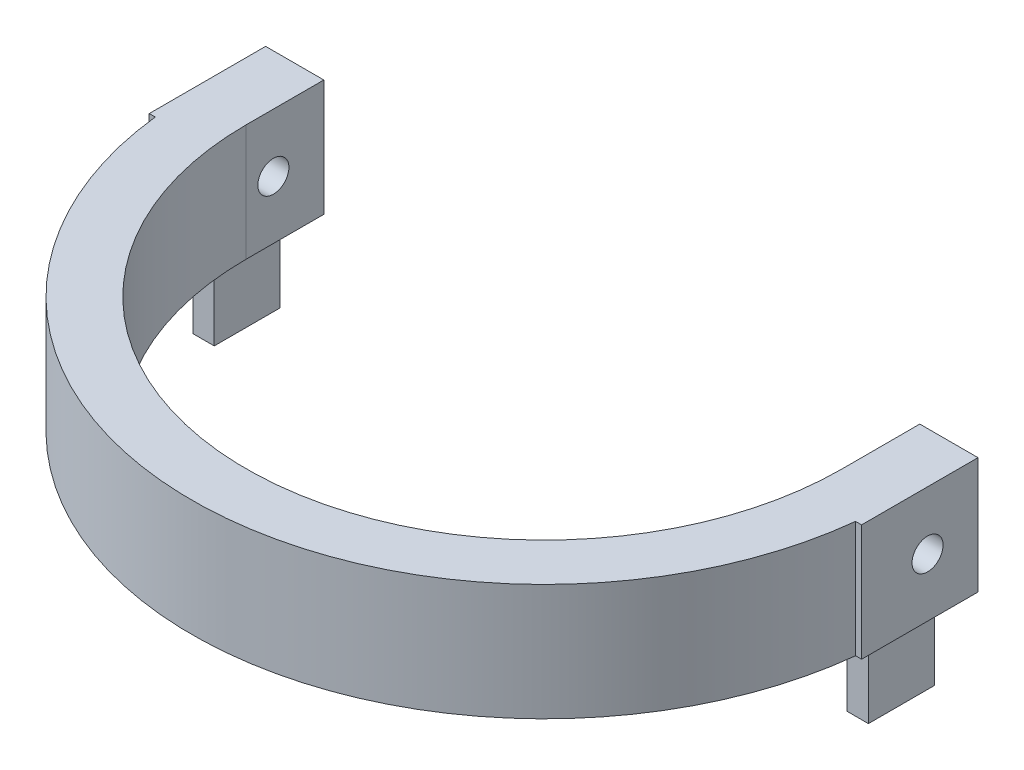
ISO-10303-21;
HEADER;
FILE_DESCRIPTION(('STEP AP214'),'2;1');
FILE_NAME('part.step','',(''),(''),'','','');
FILE_SCHEMA(('AUTOMOTIVE_DESIGN { 1 0 10303 214 1 1 1 1 }'));
ENDSEC;
DATA;
#1=APPLICATION_CONTEXT('core data for automotive mechanical design processes');
#2=APPLICATION_PROTOCOL_DEFINITION('international standard','automotive_design',2000,#1);
#3=PRODUCT_CONTEXT('',#1,'mechanical');
#4=PRODUCT('Part','Part','',(#3));
#5=PRODUCT_RELATED_PRODUCT_CATEGORY('part','',(#4));
#6=PRODUCT_DEFINITION_FORMATION('','',#4);
#7=PRODUCT_DEFINITION_CONTEXT('part definition',#1,'design');
#8=PRODUCT_DEFINITION('design','',#6,#7);
#9=PRODUCT_DEFINITION_SHAPE('','',#8);
#10=(LENGTH_UNIT() NAMED_UNIT(*) SI_UNIT(.MILLI.,.METRE.));
#11=(NAMED_UNIT(*) PLANE_ANGLE_UNIT() SI_UNIT($,.RADIAN.));
#12=(NAMED_UNIT(*) SI_UNIT($,.STERADIAN.) SOLID_ANGLE_UNIT());
#13=UNCERTAINTY_MEASURE_WITH_UNIT(LENGTH_MEASURE(1.E-05),#10,'distance_accuracy_value','');
#14=(GEOMETRIC_REPRESENTATION_CONTEXT(3) GLOBAL_UNCERTAINTY_ASSIGNED_CONTEXT((#13)) GLOBAL_UNIT_ASSIGNED_CONTEXT((#10,
#11,#12)) REPRESENTATION_CONTEXT('',''));
#15=CARTESIAN_POINT('',(0.,0.,0.));
#16=DIRECTION('',(0.,0.,1.));
#17=DIRECTION('',(1.,0.,0.));
#18=AXIS2_PLACEMENT_3D('',#15,#16,#17);
#19=CARTESIAN_POINT('',(0.,-60.,0.));
#20=DIRECTION('',(0.,1.,0.));
#21=DIRECTION('',(0.,0.,1.));
#22=AXIS2_PLACEMENT_3D('',#19,#20,#21);
#23=PLANE('',#22);
#24=DIRECTION('',(-1.,0.,0.));
#25=VECTOR('',#24,1.);
#26=CARTESIAN_POINT('',(0.,-60.,-15.8000000000004));
#27=LINE('',#26,#25);
#28=CARTESIAN_POINT('',(-79.255,-60.,-15.8000000000004));
#29=VERTEX_POINT('',#28);
#30=CARTESIAN_POINT('',(-89.355,-60.,-15.8000000000004));
#31=VERTEX_POINT('',#30);
#32=EDGE_CURVE('E249',#29,#31,#27,.T.);
#33=ORIENTED_EDGE('',*,*,#32,.T.);
#34=DIRECTION('',(0.,0.,-1.));
#35=VECTOR('',#34,1.);
#36=CARTESIAN_POINT('',(-89.355,-60.,3.49999999999958));
#37=LINE('',#36,#35);
#38=CARTESIAN_POINT('',(-89.355,-60.,5.79999999999958));
#39=VERTEX_POINT('',#38);
#40=EDGE_CURVE('E251',#31,#39,#37,.F.);
#41=ORIENTED_EDGE('',*,*,#40,.T.);
#42=DIRECTION('',(-1.,0.,0.));
#43=VECTOR('',#42,1.);
#44=CARTESIAN_POINT('',(-81.555,-60.,5.79999999999958));
#45=LINE('',#44,#43);
#46=CARTESIAN_POINT('',(-79.255,-60.,5.79999999999958));
#47=VERTEX_POINT('',#46);
#48=EDGE_CURVE('E247',#39,#47,#45,.F.);
#49=ORIENTED_EDGE('',*,*,#48,.T.);
#50=DIRECTION('',(0.,0.,-1.));
#51=VECTOR('',#50,1.);
#52=CARTESIAN_POINT('',(-79.255,-60.,0.));
#53=LINE('',#52,#51);
#54=EDGE_CURVE('E245',#47,#29,#53,.T.);
#55=ORIENTED_EDGE('',*,*,#54,.T.);
#56=EDGE_LOOP('',(#33,#41,#49,#55));
#57=FACE_BOUND('',#56,.T.);
#58=DIRECTION('',(0.,0.,-1.));
#59=VECTOR('',#58,1.);
#60=CARTESIAN_POINT('',(79.255,-60.,3.49999999999979));
#61=LINE('',#60,#59);
#62=CARTESIAN_POINT('',(79.255,-60.,-15.8000000000002));
#63=VERTEX_POINT('',#62);
#64=CARTESIAN_POINT('',(79.255,-60.,5.79999999999979));
#65=VERTEX_POINT('',#64);
#66=EDGE_CURVE('E240',#63,#65,#61,.F.);
#67=ORIENTED_EDGE('',*,*,#66,.T.);
#68=DIRECTION('',(-1.,0.,0.));
#69=VECTOR('',#68,1.);
#70=CARTESIAN_POINT('',(87.055,-60.,5.79999999999979));
#71=LINE('',#70,#69);
#72=CARTESIAN_POINT('',(89.355,-60.,5.79999999999979));
#73=VERTEX_POINT('',#72);
#74=EDGE_CURVE('E242',#65,#73,#71,.F.);
#75=ORIENTED_EDGE('',*,*,#74,.T.);
#76=DIRECTION('',(0.,0.,-1.));
#77=VECTOR('',#76,1.);
#78=CARTESIAN_POINT('',(89.355,-60.,0.));
#79=LINE('',#78,#77);
#80=CARTESIAN_POINT('',(89.355,-60.,-15.8000000000002));
#81=VERTEX_POINT('',#80);
#82=EDGE_CURVE('E235',#73,#81,#79,.T.);
#83=ORIENTED_EDGE('',*,*,#82,.T.);
#84=DIRECTION('',(-1.,0.,0.));
#85=VECTOR('',#84,1.);
#86=CARTESIAN_POINT('',(0.,-60.,-15.8000000000002));
#87=LINE('',#86,#85);
#88=EDGE_CURVE('E238',#81,#63,#87,.T.);
#89=ORIENTED_EDGE('',*,*,#88,.T.);
#90=EDGE_LOOP('',(#67,#75,#83,#89));
#91=FACE_BOUND('',#90,.T.);
#92=CARTESIAN_POINT('',(0.,-60.,0.));
#93=DIRECTION('',(0.,1.,0.));
#94=DIRECTION('',(0.,0.,1.));
#95=AXIS2_PLACEMENT_3D('',#92,#93,#94);
#96=CIRCLE('',#95,76.805);
#97=CARTESIAN_POINT('',(-76.805,-60.,0.));
#98=VERTEX_POINT('',#97);
#99=CARTESIAN_POINT('',(76.805,-60.,0.));
#100=VERTEX_POINT('',#99);
#101=EDGE_CURVE('E319',#98,#100,#96,.T.);
#102=ORIENTED_EDGE('',*,*,#101,.T.);
#103=DIRECTION('',(0.,0.,-1.));
#104=VECTOR('',#103,1.);
#105=CARTESIAN_POINT('',(76.805,-60.,0.));
#106=LINE('',#105,#104);
#107=CARTESIAN_POINT('',(76.805,-60.,-20.));
#108=VERTEX_POINT('',#107);
#109=EDGE_CURVE('E231',#100,#108,#106,.T.);
#110=ORIENTED_EDGE('',*,*,#109,.T.);
#111=DIRECTION('',(1.,0.,0.));
#112=VECTOR('',#111,1.);
#113=CARTESIAN_POINT('',(-5.31981865966166E-13,-60.,-19.999999999998));
#114=LINE('',#113,#112);
#115=CARTESIAN_POINT('',(91.805,-60.,-20.0000000000004));
#116=VERTEX_POINT('',#115);
#117=EDGE_CURVE('E346',#108,#116,#114,.T.);
#118=ORIENTED_EDGE('',*,*,#117,.T.);
#119=DIRECTION('',(0.,0.,1.));
#120=VECTOR('',#119,1.);
#121=CARTESIAN_POINT('',(91.805,-60.,0.));
#122=LINE('',#121,#120);
#123=CARTESIAN_POINT('',(91.805,-60.,9.99999999999961));
#124=VERTEX_POINT('',#123);
#125=EDGE_CURVE('E344',#116,#124,#122,.T.);
#126=ORIENTED_EDGE('',*,*,#125,.T.);
#127=DIRECTION('',(-1.,0.,0.));
#128=VECTOR('',#127,1.);
#129=CARTESIAN_POINT('',(0.,-60.,9.99999999999961));
#130=LINE('',#129,#128);
#131=CARTESIAN_POINT('',(90.252689849112,-60.,9.99999999999961));
#132=VERTEX_POINT('',#131);
#133=EDGE_CURVE('E208',#124,#132,#130,.T.);
#134=ORIENTED_EDGE('',*,*,#133,.T.);
#135=CARTESIAN_POINT('',(0.,-60.,0.));
#136=DIRECTION('',(0.,1.,0.));
#137=DIRECTION('',(0.,0.,1.));
#138=AXIS2_PLACEMENT_3D('',#135,#136,#137);
#139=CIRCLE('',#138,90.805);
#140=CARTESIAN_POINT('',(-90.252689849112,-60.,9.99999999999961));
#141=VERTEX_POINT('',#140);
#142=EDGE_CURVE('E340',#141,#132,#139,.T.);
#143=ORIENTED_EDGE('',*,*,#142,.F.);
#144=DIRECTION('',(1.,0.,0.));
#145=VECTOR('',#144,1.);
#146=CARTESIAN_POINT('',(0.,-60.,9.99999999999961));
#147=LINE('',#146,#145);
#148=CARTESIAN_POINT('',(-91.805,-60.,9.99999999999961));
#149=VERTEX_POINT('',#148);
#150=EDGE_CURVE('E337',#149,#141,#147,.T.);
#151=ORIENTED_EDGE('',*,*,#150,.F.);
#152=DIRECTION('',(0.,0.,1.));
#153=VECTOR('',#152,1.);
#154=CARTESIAN_POINT('',(-91.805,-60.,0.));
#155=LINE('',#154,#153);
#156=CARTESIAN_POINT('',(-91.805,-60.,-20.0000000000004));
#157=VERTEX_POINT('',#156);
#158=EDGE_CURVE('E334',#157,#149,#155,.T.);
#159=ORIENTED_EDGE('',*,*,#158,.F.);
#160=DIRECTION('',(-1.,0.,0.));
#161=VECTOR('',#160,1.);
#162=CARTESIAN_POINT('',(0.,-60.,-20.0000000000004));
#163=LINE('',#162,#161);
#164=CARTESIAN_POINT('',(-76.805,-60.,-20.0000000000004));
#165=VERTEX_POINT('',#164);
#166=EDGE_CURVE('E331',#165,#157,#163,.T.);
#167=ORIENTED_EDGE('',*,*,#166,.F.);
#168=DIRECTION('',(0.,0.,-1.));
#169=VECTOR('',#168,1.);
#170=CARTESIAN_POINT('',(-76.805,-60.,0.));
#171=LINE('',#170,#169);
#172=EDGE_CURVE('E323',#98,#165,#171,.T.);
#173=ORIENTED_EDGE('',*,*,#172,.F.);
#174=EDGE_LOOP('',(#102,#110,#118,#126,#134,#143,#151,#159,#167,#173));
#175=FACE_BOUND('',#174,.T.);
#176=ADVANCED_FACE('F34',(#57,#91,#175),#23,.F.);
#177=CARTESIAN_POINT('',(0.,-60.,0.));
#178=DIRECTION('',(0.,1.,0.));
#179=DIRECTION('',(0.,0.,1.));
#180=AXIS2_PLACEMENT_3D('',#177,#178,#179);
#181=CYLINDRICAL_SURFACE('',#180,76.805);
#182=DIRECTION('',(0.,1.,0.));
#183=VECTOR('',#182,1.);
#184=CARTESIAN_POINT('',(-76.805,-60.,0.));
#185=LINE('',#184,#183);
#186=CARTESIAN_POINT('',(-76.805,-30.,0.));
#187=VERTEX_POINT('',#186);
#188=EDGE_CURVE('E228',#98,#187,#185,.T.);
#189=ORIENTED_EDGE('',*,*,#188,.T.);
#190=CARTESIAN_POINT('',(0.,-30.,0.));
#191=DIRECTION('',(0.,-1.,0.));
#192=DIRECTION('',(1.,0.,0.));
#193=AXIS2_PLACEMENT_3D('',#190,#191,#192);
#194=CIRCLE('',#193,76.805);
#195=CARTESIAN_POINT('',(76.805,-30.,0.));
#196=VERTEX_POINT('',#195);
#197=EDGE_CURVE('E49',#187,#196,#194,.F.);
#198=ORIENTED_EDGE('',*,*,#197,.T.);
#199=DIRECTION('',(0.,1.,0.));
#200=VECTOR('',#199,1.);
#201=CARTESIAN_POINT('',(76.805,-60.,0.));
#202=LINE('',#201,#200);
#203=EDGE_CURVE('E236',#100,#196,#202,.T.);
#204=ORIENTED_EDGE('',*,*,#203,.F.);
#205=ORIENTED_EDGE('',*,*,#101,.F.);
#206=EDGE_LOOP('',(#189,#198,#204,#205));
#207=FACE_BOUND('',#206,.T.);
#208=ADVANCED_FACE('F421',(#207),#181,.F.);
#209=CARTESIAN_POINT('',(76.805,-60.,0.));
#210=DIRECTION('',(1.,0.,0.));
#211=DIRECTION('',(0.,0.,-1.));
#212=AXIS2_PLACEMENT_3D('',#209,#210,#211);
#213=PLANE('',#212);
#214=CARTESIAN_POINT('',(76.805,-45.,-7.00000000000039));
#215=DIRECTION('',(1.,0.,0.));
#216=DIRECTION('',(0.,0.,-1.));
#217=AXIS2_PLACEMENT_3D('',#214,#215,#216);
#218=CIRCLE('',#217,4.);
#219=CARTESIAN_POINT('',(76.805,-45.,-11.0000000000004));
#220=VERTEX_POINT('',#219);
#221=EDGE_CURVE('E205',#220,#220,#218,.T.);
#222=ORIENTED_EDGE('',*,*,#221,.T.);
#223=EDGE_LOOP('',(#222));
#224=FACE_BOUND('',#223,.T.);
#225=ORIENTED_EDGE('',*,*,#203,.T.);
#226=DIRECTION('',(0.,0.,-1.));
#227=VECTOR('',#226,1.);
#228=CARTESIAN_POINT('',(76.805,-30.,0.));
#229=LINE('',#228,#227);
#230=CARTESIAN_POINT('',(76.805,-30.,-20.));
#231=VERTEX_POINT('',#230);
#232=EDGE_CURVE('E359',#196,#231,#229,.T.);
#233=ORIENTED_EDGE('',*,*,#232,.T.);
#234=DIRECTION('',(0.,1.,0.));
#235=VECTOR('',#234,1.);
#236=CARTESIAN_POINT('',(76.805,-60.,-20.));
#237=LINE('',#236,#235);
#238=EDGE_CURVE('E211',#108,#231,#237,.T.);
#239=ORIENTED_EDGE('',*,*,#238,.F.);
#240=ORIENTED_EDGE('',*,*,#109,.F.);
#241=EDGE_LOOP('',(#225,#233,#239,#240));
#242=FACE_BOUND('',#241,.T.);
#243=ADVANCED_FACE('F358',(#224,#242),#213,.F.);
#244=CARTESIAN_POINT('',(-5.31981865966166E-13,-60.,-19.999999999998));
#245=DIRECTION('',(0.,0.,1.));
#246=DIRECTION('',(1.,0.,0.));
#247=AXIS2_PLACEMENT_3D('',#244,#245,#246);
#248=PLANE('',#247);
#249=ORIENTED_EDGE('',*,*,#238,.T.);
#250=DIRECTION('',(1.,0.,0.));
#251=VECTOR('',#250,1.);
#252=CARTESIAN_POINT('',(-5.28580632638179E-13,-30.,-19.999999999998));
#253=LINE('',#252,#251);
#254=CARTESIAN_POINT('',(91.805,-30.,-20.0000000000004));
#255=VERTEX_POINT('',#254);
#256=EDGE_CURVE('E355',#231,#255,#253,.T.);
#257=ORIENTED_EDGE('',*,*,#256,.T.);
#258=DIRECTION('',(0.,1.,0.));
#259=VECTOR('',#258,1.);
#260=CARTESIAN_POINT('',(91.805,-60.,-20.0000000000004));
#261=LINE('',#260,#259);
#262=EDGE_CURVE('E203',#116,#255,#261,.T.);
#263=ORIENTED_EDGE('',*,*,#262,.F.);
#264=ORIENTED_EDGE('',*,*,#117,.F.);
#265=EDGE_LOOP('',(#249,#257,#263,#264));
#266=FACE_BOUND('',#265,.T.);
#267=ADVANCED_FACE('F354',(#266),#248,.F.);
#268=CARTESIAN_POINT('',(91.805,-60.,0.));
#269=DIRECTION('',(-1.,0.,0.));
#270=DIRECTION('',(0.,0.,1.));
#271=AXIS2_PLACEMENT_3D('',#268,#269,#270);
#272=PLANE('',#271);
#273=CARTESIAN_POINT('',(91.805,-45.,-7.00000000000039));
#274=DIRECTION('',(1.,0.,0.));
#275=DIRECTION('',(0.,0.,-1.));
#276=AXIS2_PLACEMENT_3D('',#273,#274,#275);
#277=CIRCLE('',#276,4.);
#278=CARTESIAN_POINT('',(91.805,-45.,-11.0000000000004));
#279=VERTEX_POINT('',#278);
#280=EDGE_CURVE('E689',#279,#279,#277,.T.);
#281=ORIENTED_EDGE('',*,*,#280,.F.);
#282=EDGE_LOOP('',(#281));
#283=FACE_BOUND('',#282,.T.);
#284=ORIENTED_EDGE('',*,*,#262,.T.);
#285=DIRECTION('',(0.,0.,-1.));
#286=VECTOR('',#285,1.);
#287=CARTESIAN_POINT('',(91.805,-30.,90.805));
#288=LINE('',#287,#286);
#289=CARTESIAN_POINT('',(91.805,-30.,9.99999999999961));
#290=VERTEX_POINT('',#289);
#291=EDGE_CURVE('E185',#290,#255,#288,.T.);
#292=ORIENTED_EDGE('',*,*,#291,.F.);
#293=DIRECTION('',(0.,1.,0.));
#294=VECTOR('',#293,1.);
#295=CARTESIAN_POINT('',(91.805,-60.,9.99999999999961));
#296=LINE('',#295,#294);
#297=EDGE_CURVE('E200',#124,#290,#296,.T.);
#298=ORIENTED_EDGE('',*,*,#297,.F.);
#299=ORIENTED_EDGE('',*,*,#125,.F.);
#300=EDGE_LOOP('',(#284,#292,#298,#299));
#301=FACE_BOUND('',#300,.T.);
#302=ADVANCED_FACE('F198',(#283,#301),#272,.F.);
#303=CARTESIAN_POINT('',(0.,-60.,9.99999999999961));
#304=DIRECTION('',(0.,0.,-1.));
#305=DIRECTION('',(-1.,0.,0.));
#306=AXIS2_PLACEMENT_3D('',#303,#304,#305);
#307=PLANE('',#306);
#308=ORIENTED_EDGE('',*,*,#297,.T.);
#309=DIRECTION('',(-1.,0.,0.));
#310=VECTOR('',#309,1.);
#311=CARTESIAN_POINT('',(0.,-30.,9.99999999999961));
#312=LINE('',#311,#310);
#313=CARTESIAN_POINT('',(90.252689849112,-30.,9.99999999999961));
#314=VERTEX_POINT('',#313);
#315=EDGE_CURVE('E182',#290,#314,#312,.T.);
#316=ORIENTED_EDGE('',*,*,#315,.T.);
#317=DIRECTION('',(0.,1.,0.));
#318=VECTOR('',#317,1.);
#319=CARTESIAN_POINT('',(90.252689849112,-60.,9.99999999999961));
#320=LINE('',#319,#318);
#321=EDGE_CURVE('E209',#132,#314,#320,.T.);
#322=ORIENTED_EDGE('',*,*,#321,.F.);
#323=ORIENTED_EDGE('',*,*,#133,.F.);
#324=EDGE_LOOP('',(#308,#316,#322,#323));
#325=FACE_BOUND('',#324,.T.);
#326=ADVANCED_FACE('F207',(#325),#307,.F.);
#327=CARTESIAN_POINT('',(0.,-60.,0.));
#328=DIRECTION('',(0.,1.,0.));
#329=DIRECTION('',(0.,0.,1.));
#330=AXIS2_PLACEMENT_3D('',#327,#328,#329);
#331=CYLINDRICAL_SURFACE('',#330,90.805);
#332=CARTESIAN_POINT('',(0.,-30.,0.));
#333=DIRECTION('',(0.,-1.,0.));
#334=DIRECTION('',(1.,0.,0.));
#335=AXIS2_PLACEMENT_3D('',#332,#333,#334);
#336=CIRCLE('',#335,90.805);
#337=CARTESIAN_POINT('',(-90.252689849112,-30.,9.99999999999961));
#338=VERTEX_POINT('',#337);
#339=EDGE_CURVE('E188',#338,#314,#336,.F.);
#340=ORIENTED_EDGE('',*,*,#339,.F.);
#341=DIRECTION('',(0.,1.,0.));
#342=VECTOR('',#341,1.);
#343=CARTESIAN_POINT('',(-90.252689849112,-60.,9.99999999999961));
#344=LINE('',#343,#342);
#345=EDGE_CURVE('E213',#141,#338,#344,.T.);
#346=ORIENTED_EDGE('',*,*,#345,.F.);
#347=ORIENTED_EDGE('',*,*,#142,.T.);
#348=ORIENTED_EDGE('',*,*,#321,.T.);
#349=EDGE_LOOP('',(#340,#346,#347,#348));
#350=FACE_BOUND('',#349,.T.);
#351=ADVANCED_FACE('F442',(#350),#331,.T.);
#352=CARTESIAN_POINT('',(0.,-60.,9.99999999999961));
#353=DIRECTION('',(0.,0.,1.));
#354=DIRECTION('',(1.,0.,0.));
#355=AXIS2_PLACEMENT_3D('',#352,#353,#354);
#356=PLANE('',#355);
#357=DIRECTION('',(1.,0.,0.));
#358=VECTOR('',#357,1.);
#359=CARTESIAN_POINT('',(0.,-30.,9.99999999999961));
#360=LINE('',#359,#358);
#361=CARTESIAN_POINT('',(-91.805,-30.,9.99999999999961));
#362=VERTEX_POINT('',#361);
#363=EDGE_CURVE('E362',#362,#338,#360,.T.);
#364=ORIENTED_EDGE('',*,*,#363,.F.);
#365=DIRECTION('',(0.,1.,0.));
#366=VECTOR('',#365,1.);
#367=CARTESIAN_POINT('',(-91.805,-60.,9.99999999999961));
#368=LINE('',#367,#366);
#369=EDGE_CURVE('E219',#149,#362,#368,.T.);
#370=ORIENTED_EDGE('',*,*,#369,.F.);
#371=ORIENTED_EDGE('',*,*,#150,.T.);
#372=ORIENTED_EDGE('',*,*,#345,.T.);
#373=EDGE_LOOP('',(#364,#370,#371,#372));
#374=FACE_BOUND('',#373,.T.);
#375=ADVANCED_FACE('F445',(#374),#356,.T.);
#376=CARTESIAN_POINT('',(-91.805,-60.,0.));
#377=DIRECTION('',(-1.,0.,0.));
#378=DIRECTION('',(0.,0.,1.));
#379=AXIS2_PLACEMENT_3D('',#376,#377,#378);
#380=PLANE('',#379);
#381=CARTESIAN_POINT('',(-91.805,-45.,-7.00000000000039));
#382=DIRECTION('',(1.,0.,0.));
#383=DIRECTION('',(0.,0.,-1.));
#384=AXIS2_PLACEMENT_3D('',#381,#382,#383);
#385=CIRCLE('',#384,4.);
#386=CARTESIAN_POINT('',(-91.805,-45.,-11.0000000000004));
#387=VERTEX_POINT('',#386);
#388=EDGE_CURVE('E694',#387,#387,#385,.T.);
#389=ORIENTED_EDGE('',*,*,#388,.T.);
#390=EDGE_LOOP('',(#389));
#391=FACE_BOUND('',#390,.T.);
#392=DIRECTION('',(0.,0.,-1.));
#393=VECTOR('',#392,1.);
#394=CARTESIAN_POINT('',(-91.805,-30.,90.805));
#395=LINE('',#394,#393);
#396=CARTESIAN_POINT('',(-91.805,-30.,-20.0000000000004));
#397=VERTEX_POINT('',#396);
#398=EDGE_CURVE('E204',#362,#397,#395,.T.);
#399=ORIENTED_EDGE('',*,*,#398,.T.);
#400=DIRECTION('',(0.,1.,0.));
#401=VECTOR('',#400,1.);
#402=CARTESIAN_POINT('',(-91.805,-60.,-20.0000000000004));
#403=LINE('',#402,#401);
#404=EDGE_CURVE('E222',#157,#397,#403,.T.);
#405=ORIENTED_EDGE('',*,*,#404,.F.);
#406=ORIENTED_EDGE('',*,*,#158,.T.);
#407=ORIENTED_EDGE('',*,*,#369,.T.);
#408=EDGE_LOOP('',(#399,#405,#406,#407));
#409=FACE_BOUND('',#408,.T.);
#410=ADVANCED_FACE('F449',(#391,#409),#380,.T.);
#411=CARTESIAN_POINT('',(0.,-60.,-20.0000000000004));
#412=DIRECTION('',(0.,0.,-1.));
#413=DIRECTION('',(-1.,0.,0.));
#414=AXIS2_PLACEMENT_3D('',#411,#412,#413);
#415=PLANE('',#414);
#416=DIRECTION('',(-1.,0.,0.));
#417=VECTOR('',#416,1.);
#418=CARTESIAN_POINT('',(0.,-30.,-20.0000000000004));
#419=LINE('',#418,#417);
#420=CARTESIAN_POINT('',(-76.805,-30.,-20.0000000000004));
#421=VERTEX_POINT('',#420);
#422=EDGE_CURVE('E364',#421,#397,#419,.T.);
#423=ORIENTED_EDGE('',*,*,#422,.F.);
#424=DIRECTION('',(0.,1.,0.));
#425=VECTOR('',#424,1.);
#426=CARTESIAN_POINT('',(-76.805,-60.,-20.0000000000004));
#427=LINE('',#426,#425);
#428=EDGE_CURVE('E225',#165,#421,#427,.T.);
#429=ORIENTED_EDGE('',*,*,#428,.F.);
#430=ORIENTED_EDGE('',*,*,#166,.T.);
#431=ORIENTED_EDGE('',*,*,#404,.T.);
#432=EDGE_LOOP('',(#423,#429,#430,#431));
#433=FACE_BOUND('',#432,.T.);
#434=ADVANCED_FACE('F453',(#433),#415,.T.);
#435=CARTESIAN_POINT('',(-76.805,-60.,0.));
#436=DIRECTION('',(1.,0.,0.));
#437=DIRECTION('',(0.,0.,-1.));
#438=AXIS2_PLACEMENT_3D('',#435,#436,#437);
#439=PLANE('',#438);
#440=CARTESIAN_POINT('',(-76.805,-45.,-7.00000000000039));
#441=DIRECTION('',(1.,0.,0.));
#442=DIRECTION('',(0.,0.,-1.));
#443=AXIS2_PLACEMENT_3D('',#440,#441,#442);
#444=CIRCLE('',#443,4.);
#445=CARTESIAN_POINT('',(-76.805,-45.,-11.0000000000004));
#446=VERTEX_POINT('',#445);
#447=EDGE_CURVE('E38',#446,#446,#444,.T.);
#448=ORIENTED_EDGE('',*,*,#447,.F.);
#449=EDGE_LOOP('',(#448));
#450=FACE_BOUND('',#449,.T.);
#451=DIRECTION('',(0.,0.,-1.));
#452=VECTOR('',#451,1.);
#453=CARTESIAN_POINT('',(-76.805,-30.,0.));
#454=LINE('',#453,#452);
#455=EDGE_CURVE('E11',#187,#421,#454,.T.);
#456=ORIENTED_EDGE('',*,*,#455,.F.);
#457=ORIENTED_EDGE('',*,*,#188,.F.);
#458=ORIENTED_EDGE('',*,*,#172,.T.);
#459=ORIENTED_EDGE('',*,*,#428,.T.);
#460=EDGE_LOOP('',(#456,#457,#458,#459));
#461=FACE_BOUND('',#460,.T.);
#462=ADVANCED_FACE('F457',(#450,#461),#439,.T.);
#463=CARTESIAN_POINT('',(87.055,-80.,3.49999999999979));
#464=DIRECTION('',(0.,0.,-1.));
#465=DIRECTION('',(-1.,0.,0.));
#466=AXIS2_PLACEMENT_3D('',#463,#464,#465);
#467=PLANE('',#466);
#468=DIRECTION('',(0.,1.,0.));
#469=VECTOR('',#468,1.);
#470=CARTESIAN_POINT('',(87.055,-80.,3.49999999999979));
#471=LINE('',#470,#469);
#472=CARTESIAN_POINT('',(87.055,-80.,3.49999999999979));
#473=VERTEX_POINT('',#472);
#474=CARTESIAN_POINT('',(87.055,-62.3,3.49999999999979));
#475=VERTEX_POINT('',#474);
#476=EDGE_CURVE('E315',#473,#475,#471,.T.);
#477=ORIENTED_EDGE('',*,*,#476,.T.);
#478=DIRECTION('',(-1.,0.,0.));
#479=VECTOR('',#478,1.);
#480=CARTESIAN_POINT('',(81.555,-62.3,3.49999999999979));
#481=LINE('',#480,#479);
#482=CARTESIAN_POINT('',(81.555,-62.3,3.49999999999979));
#483=VERTEX_POINT('',#482);
#484=EDGE_CURVE('E260',#475,#483,#481,.T.);
#485=ORIENTED_EDGE('',*,*,#484,.T.);
#486=DIRECTION('',(0.,1.,0.));
#487=VECTOR('',#486,1.);
#488=CARTESIAN_POINT('',(81.555,-80.,3.49999999999979));
#489=LINE('',#488,#487);
#490=CARTESIAN_POINT('',(81.555,-80.,3.49999999999979));
#491=VERTEX_POINT('',#490);
#492=EDGE_CURVE('E314',#491,#483,#489,.T.);
#493=ORIENTED_EDGE('',*,*,#492,.F.);
#494=DIRECTION('',(-1.,0.,0.));
#495=VECTOR('',#494,1.);
#496=CARTESIAN_POINT('',(87.055,-80.,3.49999999999979));
#497=LINE('',#496,#495);
#498=EDGE_CURVE('E392',#473,#491,#497,.T.);
#499=ORIENTED_EDGE('',*,*,#498,.F.);
#500=EDGE_LOOP('',(#477,#485,#493,#499));
#501=FACE_BOUND('',#500,.T.);
#502=ADVANCED_FACE('F312',(#501),#467,.F.);
#503=CARTESIAN_POINT('',(81.555,-80.,3.49999999999979));
#504=DIRECTION('',(1.,0.,0.));
#505=DIRECTION('',(0.,0.,-1.));
#506=AXIS2_PLACEMENT_3D('',#503,#504,#505);
#507=PLANE('',#506);
#508=ORIENTED_EDGE('',*,*,#492,.T.);
#509=DIRECTION('',(0.,0.,-1.));
#510=VECTOR('',#509,1.);
#511=CARTESIAN_POINT('',(81.555,-62.3,-13.5000000000002));
#512=LINE('',#511,#510);
#513=CARTESIAN_POINT('',(81.555,-62.3,-13.5000000000002));
#514=VERTEX_POINT('',#513);
#515=EDGE_CURVE('E263',#483,#514,#512,.T.);
#516=ORIENTED_EDGE('',*,*,#515,.T.);
#517=DIRECTION('',(0.,1.,0.));
#518=VECTOR('',#517,1.);
#519=CARTESIAN_POINT('',(81.555,-80.,-13.5000000000002));
#520=LINE('',#519,#518);
#521=CARTESIAN_POINT('',(81.555,-80.,-13.5000000000002));
#522=VERTEX_POINT('',#521);
#523=EDGE_CURVE('E320',#522,#514,#520,.T.);
#524=ORIENTED_EDGE('',*,*,#523,.F.);
#525=DIRECTION('',(0.,0.,-1.));
#526=VECTOR('',#525,1.);
#527=CARTESIAN_POINT('',(81.555,-80.,3.49999999999979));
#528=LINE('',#527,#526);
#529=EDGE_CURVE('E317',#491,#522,#528,.T.);
#530=ORIENTED_EDGE('',*,*,#529,.F.);
#531=EDGE_LOOP('',(#508,#516,#524,#530));
#532=FACE_BOUND('',#531,.T.);
#533=ADVANCED_FACE('F316',(#532),#507,.F.);
#534=CARTESIAN_POINT('',(87.055,-80.,-13.5000000000002));
#535=DIRECTION('',(0.,0.,-1.));
#536=DIRECTION('',(-1.,0.,0.));
#537=AXIS2_PLACEMENT_3D('',#534,#535,#536);
#538=PLANE('',#537);
#539=ORIENTED_EDGE('',*,*,#523,.T.);
#540=DIRECTION('',(-1.,0.,0.));
#541=VECTOR('',#540,1.);
#542=CARTESIAN_POINT('',(87.055,-62.3,-13.5000000000002));
#543=LINE('',#542,#541);
#544=CARTESIAN_POINT('',(87.055,-62.3,-13.5000000000002));
#545=VERTEX_POINT('',#544);
#546=EDGE_CURVE('E57',#514,#545,#543,.F.);
#547=ORIENTED_EDGE('',*,*,#546,.T.);
#548=DIRECTION('',(0.,1.,0.));
#549=VECTOR('',#548,1.);
#550=CARTESIAN_POINT('',(87.055,-80.,-13.5000000000002));
#551=LINE('',#550,#549);
#552=CARTESIAN_POINT('',(87.055,-80.,-13.5000000000002));
#553=VERTEX_POINT('',#552);
#554=EDGE_CURVE('E325',#553,#545,#551,.T.);
#555=ORIENTED_EDGE('',*,*,#554,.F.);
#556=DIRECTION('',(-1.,0.,0.));
#557=VECTOR('',#556,1.);
#558=CARTESIAN_POINT('',(87.055,-80.,-13.5000000000002));
#559=LINE('',#558,#557);
#560=EDGE_CURVE('E395',#553,#522,#559,.T.);
#561=ORIENTED_EDGE('',*,*,#560,.T.);
#562=EDGE_LOOP('',(#539,#547,#555,#561));
#563=FACE_BOUND('',#562,.T.);
#564=ADVANCED_FACE('F405',(#563),#538,.T.);
#565=CARTESIAN_POINT('',(87.055,-80.,3.49999999999979));
#566=DIRECTION('',(1.,0.,0.));
#567=DIRECTION('',(0.,0.,-1.));
#568=AXIS2_PLACEMENT_3D('',#565,#566,#567);
#569=PLANE('',#568);
#570=ORIENTED_EDGE('',*,*,#554,.T.);
#571=DIRECTION('',(0.,0.,-1.));
#572=VECTOR('',#571,1.);
#573=CARTESIAN_POINT('',(87.055,-62.3,3.49999999999979));
#574=LINE('',#573,#572);
#575=EDGE_CURVE('E43',#545,#475,#574,.F.);
#576=ORIENTED_EDGE('',*,*,#575,.T.);
#577=ORIENTED_EDGE('',*,*,#476,.F.);
#578=DIRECTION('',(0.,0.,-1.));
#579=VECTOR('',#578,1.);
#580=CARTESIAN_POINT('',(87.055,-80.,3.49999999999979));
#581=LINE('',#580,#579);
#582=EDGE_CURVE('E398',#473,#553,#581,.T.);
#583=ORIENTED_EDGE('',*,*,#582,.T.);
#584=EDGE_LOOP('',(#570,#576,#577,#583));
#585=FACE_BOUND('',#584,.T.);
#586=ADVANCED_FACE('F402',(#585),#569,.T.);
#587=CARTESIAN_POINT('',(0.,-80.,0.));
#588=DIRECTION('',(0.,-1.,0.));
#589=DIRECTION('',(0.,0.,-1.));
#590=AXIS2_PLACEMENT_3D('',#587,#588,#589);
#591=PLANE('',#590);
#592=ORIENTED_EDGE('',*,*,#498,.T.);
#593=ORIENTED_EDGE('',*,*,#529,.T.);
#594=ORIENTED_EDGE('',*,*,#560,.F.);
#595=ORIENTED_EDGE('',*,*,#582,.F.);
#596=EDGE_LOOP('',(#592,#593,#594,#595));
#597=FACE_BOUND('',#596,.T.);
#598=ADVANCED_FACE('F407',(#597),#591,.T.);
#599=CARTESIAN_POINT('',(-81.555,-80.,3.49999999999958));
#600=DIRECTION('',(0.,0.,-1.));
#601=DIRECTION('',(-1.,0.,0.));
#602=AXIS2_PLACEMENT_3D('',#599,#600,#601);
#603=PLANE('',#602);
#604=DIRECTION('',(0.,1.,0.));
#605=VECTOR('',#604,1.);
#606=CARTESIAN_POINT('',(-81.555,-80.,3.49999999999958));
#607=LINE('',#606,#605);
#608=CARTESIAN_POINT('',(-81.555,-80.,3.49999999999958));
#609=VERTEX_POINT('',#608);
#610=CARTESIAN_POINT('',(-81.555,-62.3,3.49999999999958));
#611=VERTEX_POINT('',#610);
#612=EDGE_CURVE('E378',#609,#611,#607,.T.);
#613=ORIENTED_EDGE('',*,*,#612,.T.);
#614=DIRECTION('',(-1.,0.,0.));
#615=VECTOR('',#614,1.);
#616=CARTESIAN_POINT('',(-87.055,-62.3,3.49999999999958));
#617=LINE('',#616,#615);
#618=CARTESIAN_POINT('',(-87.055,-62.3,3.49999999999958));
#619=VERTEX_POINT('',#618);
#620=EDGE_CURVE('E256',#611,#619,#617,.T.);
#621=ORIENTED_EDGE('',*,*,#620,.T.);
#622=DIRECTION('',(0.,1.,0.));
#623=VECTOR('',#622,1.);
#624=CARTESIAN_POINT('',(-87.055,-80.,3.49999999999958));
#625=LINE('',#624,#623);
#626=CARTESIAN_POINT('',(-87.055,-80.,3.49999999999958));
#627=VERTEX_POINT('',#626);
#628=EDGE_CURVE('E278',#627,#619,#625,.T.);
#629=ORIENTED_EDGE('',*,*,#628,.F.);
#630=DIRECTION('',(-1.,0.,0.));
#631=VECTOR('',#630,1.);
#632=CARTESIAN_POINT('',(-81.555,-80.,3.49999999999958));
#633=LINE('',#632,#631);
#634=EDGE_CURVE('E389',#609,#627,#633,.T.);
#635=ORIENTED_EDGE('',*,*,#634,.F.);
#636=EDGE_LOOP('',(#613,#621,#629,#635));
#637=FACE_BOUND('',#636,.T.);
#638=ADVANCED_FACE('F409',(#637),#603,.F.);
#639=CARTESIAN_POINT('',(-87.055,-80.,3.49999999999958));
#640=DIRECTION('',(1.,0.,0.));
#641=DIRECTION('',(0.,0.,-1.));
#642=AXIS2_PLACEMENT_3D('',#639,#640,#641);
#643=PLANE('',#642);
#644=ORIENTED_EDGE('',*,*,#628,.T.);
#645=DIRECTION('',(0.,0.,-1.));
#646=VECTOR('',#645,1.);
#647=CARTESIAN_POINT('',(-87.055,-62.3,-13.5000000000004));
#648=LINE('',#647,#646);
#649=CARTESIAN_POINT('',(-87.055,-62.3,-13.5000000000004));
#650=VERTEX_POINT('',#649);
#651=EDGE_CURVE('E232',#619,#650,#648,.T.);
#652=ORIENTED_EDGE('',*,*,#651,.T.);
#653=DIRECTION('',(0.,1.,0.));
#654=VECTOR('',#653,1.);
#655=CARTESIAN_POINT('',(-87.055,-80.,-13.5000000000004));
#656=LINE('',#655,#654);
#657=CARTESIAN_POINT('',(-87.055,-80.,-13.5000000000004));
#658=VERTEX_POINT('',#657);
#659=EDGE_CURVE('E372',#658,#650,#656,.T.);
#660=ORIENTED_EDGE('',*,*,#659,.F.);
#661=DIRECTION('',(0.,0.,-1.));
#662=VECTOR('',#661,1.);
#663=CARTESIAN_POINT('',(-87.055,-80.,3.49999999999958));
#664=LINE('',#663,#662);
#665=EDGE_CURVE('E387',#627,#658,#664,.T.);
#666=ORIENTED_EDGE('',*,*,#665,.F.);
#667=EDGE_LOOP('',(#644,#652,#660,#666));
#668=FACE_BOUND('',#667,.T.);
#669=ADVANCED_FACE('F415',(#668),#643,.F.);
#670=CARTESIAN_POINT('',(-81.555,-80.,-13.5000000000004));
#671=DIRECTION('',(0.,0.,-1.));
#672=DIRECTION('',(-1.,0.,0.));
#673=AXIS2_PLACEMENT_3D('',#670,#671,#672);
#674=PLANE('',#673);
#675=ORIENTED_EDGE('',*,*,#659,.T.);
#676=DIRECTION('',(-1.,0.,0.));
#677=VECTOR('',#676,1.);
#678=CARTESIAN_POINT('',(-81.555,-62.3,-13.5000000000004));
#679=LINE('',#678,#677);
#680=CARTESIAN_POINT('',(-81.555,-62.3,-13.5000000000004));
#681=VERTEX_POINT('',#680);
#682=EDGE_CURVE('E254',#650,#681,#679,.F.);
#683=ORIENTED_EDGE('',*,*,#682,.T.);
#684=DIRECTION('',(0.,1.,0.));
#685=VECTOR('',#684,1.);
#686=CARTESIAN_POINT('',(-81.555,-80.,-13.5000000000004));
#687=LINE('',#686,#685);
#688=CARTESIAN_POINT('',(-81.555,-80.,-13.5000000000004));
#689=VERTEX_POINT('',#688);
#690=EDGE_CURVE('E375',#689,#681,#687,.T.);
#691=ORIENTED_EDGE('',*,*,#690,.F.);
#692=DIRECTION('',(-1.,0.,0.));
#693=VECTOR('',#692,1.);
#694=CARTESIAN_POINT('',(-81.555,-80.,-13.5000000000004));
#695=LINE('',#694,#693);
#696=EDGE_CURVE('E384',#689,#658,#695,.T.);
#697=ORIENTED_EDGE('',*,*,#696,.T.);
#698=EDGE_LOOP('',(#675,#683,#691,#697));
#699=FACE_BOUND('',#698,.T.);
#700=ADVANCED_FACE('F517',(#699),#674,.T.);
#701=CARTESIAN_POINT('',(-81.555,-80.,3.49999999999958));
#702=DIRECTION('',(1.,0.,0.));
#703=DIRECTION('',(0.,0.,-1.));
#704=AXIS2_PLACEMENT_3D('',#701,#702,#703);
#705=PLANE('',#704);
#706=ORIENTED_EDGE('',*,*,#690,.T.);
#707=DIRECTION('',(0.,0.,-1.));
#708=VECTOR('',#707,1.);
#709=CARTESIAN_POINT('',(-81.555,-62.3,3.49999999999958));
#710=LINE('',#709,#708);
#711=EDGE_CURVE('E258',#681,#611,#710,.F.);
#712=ORIENTED_EDGE('',*,*,#711,.T.);
#713=ORIENTED_EDGE('',*,*,#612,.F.);
#714=DIRECTION('',(0.,0.,-1.));
#715=VECTOR('',#714,1.);
#716=CARTESIAN_POINT('',(-81.555,-80.,3.49999999999958));
#717=LINE('',#716,#715);
#718=EDGE_CURVE('E381',#609,#689,#717,.T.);
#719=ORIENTED_EDGE('',*,*,#718,.T.);
#720=EDGE_LOOP('',(#706,#712,#713,#719));
#721=FACE_BOUND('',#720,.T.);
#722=ADVANCED_FACE('F511',(#721),#705,.T.);
#723=CARTESIAN_POINT('',(0.,-80.,0.));
#724=DIRECTION('',(0.,-1.,0.));
#725=DIRECTION('',(0.,0.,-1.));
#726=AXIS2_PLACEMENT_3D('',#723,#724,#725);
#727=PLANE('',#726);
#728=ORIENTED_EDGE('',*,*,#634,.T.);
#729=ORIENTED_EDGE('',*,*,#665,.T.);
#730=ORIENTED_EDGE('',*,*,#696,.F.);
#731=ORIENTED_EDGE('',*,*,#718,.F.);
#732=EDGE_LOOP('',(#728,#729,#730,#731));
#733=FACE_BOUND('',#732,.T.);
#734=ADVANCED_FACE('F477',(#733),#727,.T.);
#735=CARTESIAN_POINT('',(-79.255,-62.3,0.));
#736=DIRECTION('',(0.,0.,-1.));
#737=DIRECTION('',(-1.,0.,0.));
#738=AXIS2_PLACEMENT_3D('',#735,#736,#737);
#739=CYLINDRICAL_SURFACE('',#738,2.3);
#740=CARTESIAN_POINT('',(-79.255,-62.3,-15.8000000000004));
#741=DIRECTION('',(-0.707106781186547,0.,-0.707106781186547));
#742=DIRECTION('',(0.707106781186547,0.,-0.707106781186547));
#743=AXIS2_PLACEMENT_3D('',#740,#741,#742);
#744=ELLIPSE('',#743,3.25269119345812,2.3);
#745=EDGE_CURVE('E272',#29,#681,#744,.F.);
#746=ORIENTED_EDGE('',*,*,#745,.F.);
#747=ORIENTED_EDGE('',*,*,#54,.F.);
#748=CARTESIAN_POINT('',(-79.255,-62.3,5.79999999999958));
#749=DIRECTION('',(0.707106781186547,0.,-0.707106781186547));
#750=DIRECTION('',(-0.707106781186547,0.,-0.707106781186547));
#751=AXIS2_PLACEMENT_3D('',#748,#749,#750);
#752=ELLIPSE('',#751,3.25269119345812,2.3);
#753=EDGE_CURVE('E275',#611,#47,#752,.T.);
#754=ORIENTED_EDGE('',*,*,#753,.F.);
#755=ORIENTED_EDGE('',*,*,#711,.F.);
#756=EDGE_LOOP('',(#746,#747,#754,#755));
#757=FACE_BOUND('',#756,.T.);
#758=ADVANCED_FACE('F473',(#757),#739,.F.);
#759=CARTESIAN_POINT('',(-81.555,-62.3,5.79999999999958));
#760=DIRECTION('',(1.,0.,0.));
#761=DIRECTION('',(0.,0.,-1.));
#762=AXIS2_PLACEMENT_3D('',#759,#760,#761);
#763=CYLINDRICAL_SURFACE('',#762,2.3);
#764=ORIENTED_EDGE('',*,*,#753,.T.);
#765=ORIENTED_EDGE('',*,*,#48,.F.);
#766=CARTESIAN_POINT('',(-89.355,-62.3,5.79999999999958));
#767=DIRECTION('',(0.707106781186547,0.,0.707106781186547));
#768=DIRECTION('',(0.707106781186547,0.,-0.707106781186547));
#769=AXIS2_PLACEMENT_3D('',#766,#767,#768);
#770=ELLIPSE('',#769,3.25269119345812,2.3);
#771=EDGE_CURVE('E269',#619,#39,#770,.T.);
#772=ORIENTED_EDGE('',*,*,#771,.F.);
#773=ORIENTED_EDGE('',*,*,#620,.F.);
#774=EDGE_LOOP('',(#764,#765,#772,#773));
#775=FACE_BOUND('',#774,.T.);
#776=ADVANCED_FACE('F469',(#775),#763,.F.);
#777=CARTESIAN_POINT('',(0.,-62.3,-15.8000000000004));
#778=DIRECTION('',(-1.,0.,0.));
#779=DIRECTION('',(0.,0.,1.));
#780=AXIS2_PLACEMENT_3D('',#777,#778,#779);
#781=CYLINDRICAL_SURFACE('',#780,2.3);
#782=ORIENTED_EDGE('',*,*,#745,.T.);
#783=ORIENTED_EDGE('',*,*,#682,.F.);
#784=CARTESIAN_POINT('',(-89.355,-62.3,-15.8000000000004));
#785=DIRECTION('',(-0.707106781186547,0.,0.707106781186547));
#786=DIRECTION('',(-0.707106781186547,0.,-0.707106781186547));
#787=AXIS2_PLACEMENT_3D('',#784,#785,#786);
#788=ELLIPSE('',#787,3.25269119345812,2.3);
#789=EDGE_CURVE('E267',#31,#650,#788,.F.);
#790=ORIENTED_EDGE('',*,*,#789,.F.);
#791=ORIENTED_EDGE('',*,*,#32,.F.);
#792=EDGE_LOOP('',(#782,#783,#790,#791));
#793=FACE_BOUND('',#792,.T.);
#794=ADVANCED_FACE('F465',(#793),#781,.F.);
#795=CARTESIAN_POINT('',(-89.355,-62.3,3.49999999999958));
#796=DIRECTION('',(0.,0.,1.));
#797=DIRECTION('',(1.,0.,0.));
#798=AXIS2_PLACEMENT_3D('',#795,#796,#797);
#799=CYLINDRICAL_SURFACE('',#798,2.3);
#800=ORIENTED_EDGE('',*,*,#771,.T.);
#801=ORIENTED_EDGE('',*,*,#40,.F.);
#802=ORIENTED_EDGE('',*,*,#789,.T.);
#803=ORIENTED_EDGE('',*,*,#651,.F.);
#804=EDGE_LOOP('',(#800,#801,#802,#803));
#805=FACE_BOUND('',#804,.T.);
#806=ADVANCED_FACE('F462',(#805),#799,.F.);
#807=CARTESIAN_POINT('',(0.,-62.3,-15.8000000000002));
#808=DIRECTION('',(-1.,0.,0.));
#809=DIRECTION('',(0.,0.,1.));
#810=AXIS2_PLACEMENT_3D('',#807,#808,#809);
#811=CYLINDRICAL_SURFACE('',#810,2.3);
#812=CARTESIAN_POINT('',(79.255,-62.3,-15.8000000000002));
#813=DIRECTION('',(-0.707106781186547,0.,0.707106781186547));
#814=DIRECTION('',(-0.707106781186547,0.,-0.707106781186547));
#815=AXIS2_PLACEMENT_3D('',#812,#813,#814);
#816=ELLIPSE('',#815,3.25269119345812,2.3);
#817=EDGE_CURVE('E282',#63,#514,#816,.F.);
#818=ORIENTED_EDGE('',*,*,#817,.F.);
#819=ORIENTED_EDGE('',*,*,#88,.F.);
#820=CARTESIAN_POINT('',(89.355,-62.3,-15.8000000000002));
#821=DIRECTION('',(-0.707106781186547,0.,-0.707106781186547));
#822=DIRECTION('',(0.707106781186547,0.,-0.707106781186547));
#823=AXIS2_PLACEMENT_3D('',#820,#821,#822);
#824=ELLIPSE('',#823,3.25269119345812,2.3);
#825=EDGE_CURVE('E270',#545,#81,#824,.T.);
#826=ORIENTED_EDGE('',*,*,#825,.F.);
#827=ORIENTED_EDGE('',*,*,#546,.F.);
#828=EDGE_LOOP('',(#818,#819,#826,#827));
#829=FACE_BOUND('',#828,.T.);
#830=ADVANCED_FACE('F36',(#829),#811,.F.);
#831=CARTESIAN_POINT('',(89.355,-62.3,0.));
#832=DIRECTION('',(0.,0.,-1.));
#833=DIRECTION('',(-1.,0.,0.));
#834=AXIS2_PLACEMENT_3D('',#831,#832,#833);
#835=CYLINDRICAL_SURFACE('',#834,2.3);
#836=ORIENTED_EDGE('',*,*,#825,.T.);
#837=ORIENTED_EDGE('',*,*,#82,.F.);
#838=CARTESIAN_POINT('',(89.355,-62.3,5.79999999999979));
#839=DIRECTION('',(0.707106781186547,0.,-0.707106781186547));
#840=DIRECTION('',(-0.707106781186547,0.,-0.707106781186547));
#841=AXIS2_PLACEMENT_3D('',#838,#839,#840);
#842=ELLIPSE('',#841,3.25269119345812,2.3);
#843=EDGE_CURVE('E280',#475,#73,#842,.T.);
#844=ORIENTED_EDGE('',*,*,#843,.F.);
#845=ORIENTED_EDGE('',*,*,#575,.F.);
#846=EDGE_LOOP('',(#836,#837,#844,#845));
#847=FACE_BOUND('',#846,.T.);
#848=ADVANCED_FACE('F290',(#847),#835,.F.);
#849=CARTESIAN_POINT('',(79.255,-62.3,3.49999999999979));
#850=DIRECTION('',(0.,0.,1.));
#851=DIRECTION('',(1.,0.,0.));
#852=AXIS2_PLACEMENT_3D('',#849,#850,#851);
#853=CYLINDRICAL_SURFACE('',#852,2.3);
#854=ORIENTED_EDGE('',*,*,#817,.T.);
#855=ORIENTED_EDGE('',*,*,#515,.F.);
#856=CARTESIAN_POINT('',(79.255,-62.3,5.79999999999979));
#857=DIRECTION('',(0.707106781186547,0.,0.707106781186547));
#858=DIRECTION('',(-0.707106781186547,0.,0.707106781186547));
#859=AXIS2_PLACEMENT_3D('',#856,#857,#858);
#860=ELLIPSE('',#859,3.25269119345812,2.3);
#861=EDGE_CURVE('E193',#65,#483,#860,.F.);
#862=ORIENTED_EDGE('',*,*,#861,.F.);
#863=ORIENTED_EDGE('',*,*,#66,.F.);
#864=EDGE_LOOP('',(#854,#855,#862,#863));
#865=FACE_BOUND('',#864,.T.);
#866=ADVANCED_FACE('F305',(#865),#853,.F.);
#867=CARTESIAN_POINT('',(87.055,-62.3,5.79999999999979));
#868=DIRECTION('',(1.,0.,0.));
#869=DIRECTION('',(0.,0.,-1.));
#870=AXIS2_PLACEMENT_3D('',#867,#868,#869);
#871=CYLINDRICAL_SURFACE('',#870,2.3);
#872=ORIENTED_EDGE('',*,*,#843,.T.);
#873=ORIENTED_EDGE('',*,*,#74,.F.);
#874=ORIENTED_EDGE('',*,*,#861,.T.);
#875=ORIENTED_EDGE('',*,*,#484,.F.);
#876=EDGE_LOOP('',(#872,#873,#874,#875));
#877=FACE_BOUND('',#876,.T.);
#878=ADVANCED_FACE('F301',(#877),#871,.F.);
#879=CARTESIAN_POINT('',(-91.805,-30.,90.805));
#880=DIRECTION('',(0.,-1.,0.));
#881=DIRECTION('',(1.,0.,0.));
#882=AXIS2_PLACEMENT_3D('',#879,#880,#881);
#883=PLANE('',#882);
#884=ORIENTED_EDGE('',*,*,#291,.T.);
#885=ORIENTED_EDGE('',*,*,#256,.F.);
#886=ORIENTED_EDGE('',*,*,#232,.F.);
#887=ORIENTED_EDGE('',*,*,#197,.F.);
#888=ORIENTED_EDGE('',*,*,#455,.T.);
#889=ORIENTED_EDGE('',*,*,#422,.T.);
#890=ORIENTED_EDGE('',*,*,#398,.F.);
#891=ORIENTED_EDGE('',*,*,#363,.T.);
#892=ORIENTED_EDGE('',*,*,#339,.T.);
#893=ORIENTED_EDGE('',*,*,#315,.F.);
#894=EDGE_LOOP('',(#884,#885,#886,#887,#888,#889,#890,#891,#892,#893));
#895=FACE_BOUND('',#894,.T.);
#896=ADVANCED_FACE('F184',(#895),#883,.F.);
#897=CARTESIAN_POINT('',(-91.805,-45.,-7.00000000000039));
#898=DIRECTION('',(1.,0.,0.));
#899=DIRECTION('',(0.,0.,-1.));
#900=AXIS2_PLACEMENT_3D('',#897,#898,#899);
#901=CYLINDRICAL_SURFACE('',#900,4.);
#902=ORIENTED_EDGE('',*,*,#447,.T.);
#903=EDGE_LOOP('',(#902));
#904=FACE_BOUND('',#903,.T.);
#905=ORIENTED_EDGE('',*,*,#388,.F.);
#906=EDGE_LOOP('',(#905));
#907=FACE_BOUND('',#906,.T.);
#908=ADVANCED_FACE('F665',(#904,#907),#901,.F.);
#909=ORIENTED_EDGE('',*,*,#280,.T.);
#910=EDGE_LOOP('',(#909));
#911=FACE_BOUND('',#910,.T.);
#912=ORIENTED_EDGE('',*,*,#221,.F.);
#913=EDGE_LOOP('',(#912));
#914=FACE_BOUND('',#913,.T.);
#915=ADVANCED_FACE('F670',(#911,#914),#901,.F.);
#916=CLOSED_SHELL('',(#176,#208,#243,#267,#302,#326,#351,#375,#410,#434,#462,#502,#533,#564,
#586,#598,#638,#669,#700,#722,#734,#758,#776,#794,#806,#830,#848,#866,#878,#896,#908,#915));
#917=MANIFOLD_SOLID_BREP('B2',#916);
#918=ADVANCED_BREP_SHAPE_REPRESENTATION('',(#18,#917),#14);
#919=SHAPE_DEFINITION_REPRESENTATION(#9,#918);
ENDSEC;
END-ISO-10303-21;
